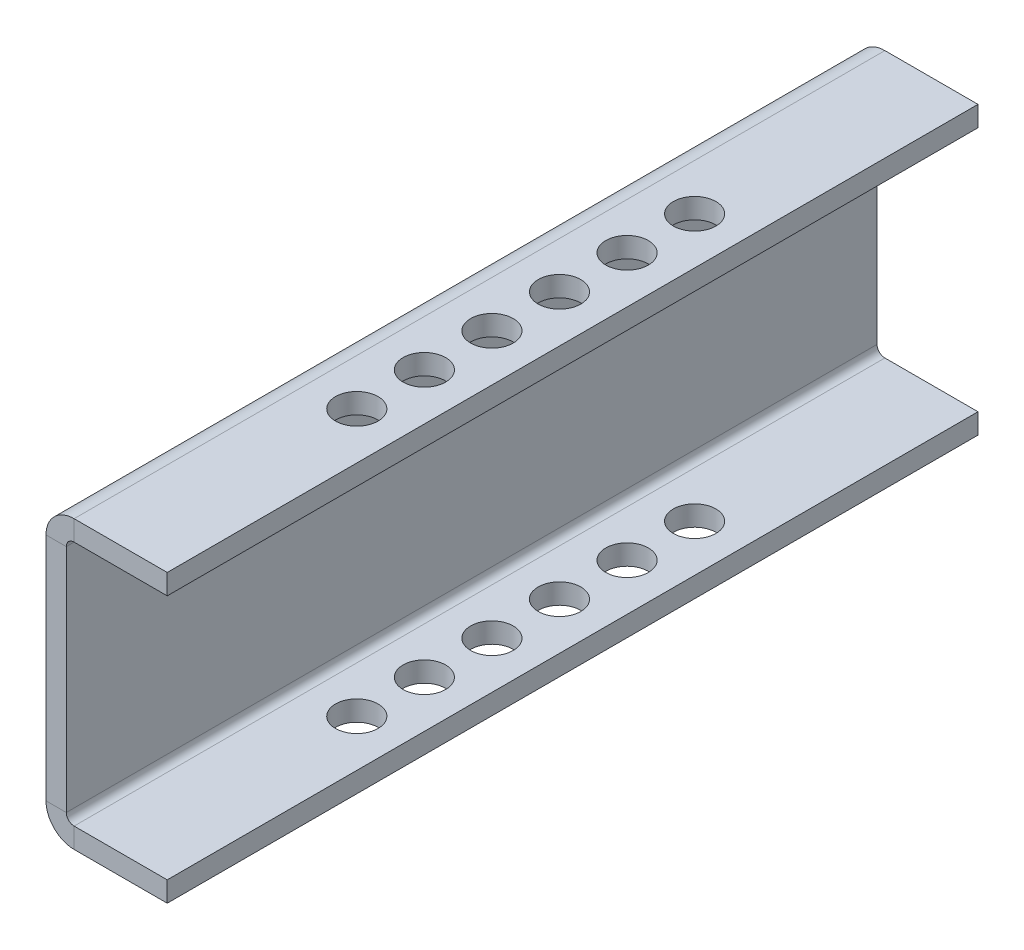
ISO-10303-21;
HEADER;
FILE_DESCRIPTION(('STEP AP214'),'2;1');
FILE_NAME('part.step','',(''),(''),'','','');
FILE_SCHEMA(('AUTOMOTIVE_DESIGN { 1 0 10303 214 1 1 1 1 }'));
ENDSEC;
DATA;
#1=APPLICATION_CONTEXT('core data for automotive mechanical design processes');
#2=APPLICATION_PROTOCOL_DEFINITION('international standard','automotive_design',2000,#1);
#3=PRODUCT_CONTEXT('',#1,'mechanical');
#4=PRODUCT('Part','Part','',(#3));
#5=PRODUCT_RELATED_PRODUCT_CATEGORY('part','',(#4));
#6=PRODUCT_DEFINITION_FORMATION('','',#4);
#7=PRODUCT_DEFINITION_CONTEXT('part definition',#1,'design');
#8=PRODUCT_DEFINITION('design','',#6,#7);
#9=PRODUCT_DEFINITION_SHAPE('','',#8);
#10=(LENGTH_UNIT() NAMED_UNIT(*) SI_UNIT(.MILLI.,.METRE.));
#11=(NAMED_UNIT(*) PLANE_ANGLE_UNIT() SI_UNIT($,.RADIAN.));
#12=(NAMED_UNIT(*) SI_UNIT($,.STERADIAN.) SOLID_ANGLE_UNIT());
#13=UNCERTAINTY_MEASURE_WITH_UNIT(LENGTH_MEASURE(1.E-05),#10,'distance_accuracy_value','');
#14=(GEOMETRIC_REPRESENTATION_CONTEXT(3) GLOBAL_UNCERTAINTY_ASSIGNED_CONTEXT((#13)) GLOBAL_UNIT_ASSIGNED_CONTEXT((#10,
#11,#12)) REPRESENTATION_CONTEXT('',''));
#15=CARTESIAN_POINT('',(0.,0.,0.));
#16=DIRECTION('',(0.,0.,1.));
#17=DIRECTION('',(1.,0.,0.));
#18=AXIS2_PLACEMENT_3D('',#15,#16,#17);
#19=CARTESIAN_POINT('',(-1.905,0.,0.));
#20=DIRECTION('',(-1.,0.,0.));
#21=DIRECTION('',(0.,0.,1.));
#22=AXIS2_PLACEMENT_3D('',#19,#20,#21);
#23=PLANE('',#22);
#24=DIRECTION('',(0.,-1.,0.));
#25=VECTOR('',#24,1.);
#26=CARTESIAN_POINT('',(-1.905,22.225,38.1));
#27=LINE('',#26,#25);
#28=CARTESIAN_POINT('',(-1.905,10.8204,38.1));
#29=VERTEX_POINT('',#28);
#30=CARTESIAN_POINT('',(-1.905,-10.8204,38.1));
#31=VERTEX_POINT('',#30);
#32=EDGE_CURVE('E248',#29,#31,#27,.T.);
#33=ORIENTED_EDGE('',*,*,#32,.F.);
#34=DIRECTION('',(0.,0.,-1.));
#35=VECTOR('',#34,1.);
#36=CARTESIAN_POINT('',(-1.905,10.8204,0.));
#37=LINE('',#36,#35);
#38=CARTESIAN_POINT('',(-1.905,10.8204,-38.1));
#39=VERTEX_POINT('',#38);
#40=EDGE_CURVE('E239',#29,#39,#37,.T.);
#41=ORIENTED_EDGE('',*,*,#40,.T.);
#42=DIRECTION('',(0.,1.,0.));
#43=VECTOR('',#42,1.);
#44=CARTESIAN_POINT('',(-1.905,22.225,-38.1));
#45=LINE('',#44,#43);
#46=CARTESIAN_POINT('',(-1.905,-10.8204,-38.1));
#47=VERTEX_POINT('',#46);
#48=EDGE_CURVE('E231',#47,#39,#45,.T.);
#49=ORIENTED_EDGE('',*,*,#48,.F.);
#50=DIRECTION('',(0.,0.,-1.));
#51=VECTOR('',#50,1.);
#52=CARTESIAN_POINT('',(-1.905,-10.8204,0.));
#53=LINE('',#52,#51);
#54=EDGE_CURVE('E227',#31,#47,#53,.T.);
#55=ORIENTED_EDGE('',*,*,#54,.F.);
#56=EDGE_LOOP('',(#33,#41,#49,#55));
#57=FACE_BOUND('',#56,.T.);
#58=ADVANCED_FACE('F47',(#57),#23,.T.);
#59=CARTESIAN_POINT('',(-1.905,22.225,-38.1));
#60=DIRECTION('',(0.,0.,-1.));
#61=DIRECTION('',(-1.,0.,0.));
#62=AXIS2_PLACEMENT_3D('',#59,#60,#61);
#63=PLANE('',#62);
#64=ORIENTED_EDGE('',*,*,#48,.T.);
#65=DIRECTION('',(1.,0.,0.));
#66=VECTOR('',#65,1.);
#67=CARTESIAN_POINT('',(-1.905,10.8204,-38.1));
#68=LINE('',#67,#66);
#69=CARTESIAN_POINT('',(0.,10.8204,-38.1));
#70=VERTEX_POINT('',#69);
#71=EDGE_CURVE('E12',#39,#70,#68,.T.);
#72=ORIENTED_EDGE('',*,*,#71,.T.);
#73=DIRECTION('',(0.,1.,0.));
#74=VECTOR('',#73,1.);
#75=CARTESIAN_POINT('',(0.,22.225,-38.1));
#76=LINE('',#75,#74);
#77=CARTESIAN_POINT('',(0.,-10.8204,-38.1));
#78=VERTEX_POINT('',#77);
#79=EDGE_CURVE('E249',#78,#70,#76,.T.);
#80=ORIENTED_EDGE('',*,*,#79,.F.);
#81=DIRECTION('',(1.,0.,0.));
#82=VECTOR('',#81,1.);
#83=CARTESIAN_POINT('',(-1.905,-10.8204,-38.1));
#84=LINE('',#83,#82);
#85=EDGE_CURVE('E230',#47,#78,#84,.T.);
#86=ORIENTED_EDGE('',*,*,#85,.F.);
#87=EDGE_LOOP('',(#64,#72,#80,#86));
#88=FACE_BOUND('',#87,.T.);
#89=ADVANCED_FACE('F49',(#88),#63,.T.);
#90=CARTESIAN_POINT('',(-1.905,22.225,38.1));
#91=DIRECTION('',(0.,0.,1.));
#92=DIRECTION('',(0.,-1.,0.));
#93=AXIS2_PLACEMENT_3D('',#90,#91,#92);
#94=PLANE('',#93);
#95=DIRECTION('',(0.,-1.,0.));
#96=VECTOR('',#95,1.);
#97=CARTESIAN_POINT('',(0.,22.225,38.1));
#98=LINE('',#97,#96);
#99=CARTESIAN_POINT('',(0.,10.8204,38.1));
#100=VERTEX_POINT('',#99);
#101=CARTESIAN_POINT('',(0.,-10.8204,38.1));
#102=VERTEX_POINT('',#101);
#103=EDGE_CURVE('E70',#100,#102,#98,.T.);
#104=ORIENTED_EDGE('',*,*,#103,.F.);
#105=DIRECTION('',(-1.,0.,0.));
#106=VECTOR('',#105,1.);
#107=CARTESIAN_POINT('',(-1.905,10.8204,38.1));
#108=LINE('',#107,#106);
#109=EDGE_CURVE('E242',#100,#29,#108,.T.);
#110=ORIENTED_EDGE('',*,*,#109,.T.);
#111=ORIENTED_EDGE('',*,*,#32,.T.);
#112=DIRECTION('',(-1.,0.,0.));
#113=VECTOR('',#112,1.);
#114=CARTESIAN_POINT('',(-1.905,-10.8204,38.1));
#115=LINE('',#114,#113);
#116=EDGE_CURVE('E236',#102,#31,#115,.T.);
#117=ORIENTED_EDGE('',*,*,#116,.F.);
#118=EDGE_LOOP('',(#104,#110,#111,#117));
#119=FACE_BOUND('',#118,.T.);
#120=ADVANCED_FACE('F308',(#119),#94,.T.);
#121=CARTESIAN_POINT('',(0.,0.,0.));
#122=DIRECTION('',(-1.,0.,0.));
#123=DIRECTION('',(0.,0.,1.));
#124=AXIS2_PLACEMENT_3D('',#121,#122,#123);
#125=PLANE('',#124);
#126=DIRECTION('',(0.,0.,-1.));
#127=VECTOR('',#126,1.);
#128=CARTESIAN_POINT('',(0.,10.8204,0.));
#129=LINE('',#128,#127);
#130=EDGE_CURVE('E56',#100,#70,#129,.T.);
#131=ORIENTED_EDGE('',*,*,#130,.F.);
#132=ORIENTED_EDGE('',*,*,#103,.T.);
#133=DIRECTION('',(0.,0.,-1.));
#134=VECTOR('',#133,1.);
#135=CARTESIAN_POINT('',(0.,-10.8204,0.));
#136=LINE('',#135,#134);
#137=EDGE_CURVE('E234',#102,#78,#136,.T.);
#138=ORIENTED_EDGE('',*,*,#137,.T.);
#139=ORIENTED_EDGE('',*,*,#79,.T.);
#140=EDGE_LOOP('',(#131,#132,#138,#139));
#141=FACE_BOUND('',#140,.T.);
#142=ADVANCED_FACE('F368',(#141),#125,.F.);
#143=CARTESIAN_POINT('',(0.7366,-10.8204,38.1));
#144=DIRECTION('',(0.,0.,1.));
#145=DIRECTION('',(1.,0.,0.));
#146=AXIS2_PLACEMENT_3D('',#143,#144,#145);
#147=PLANE('',#146);
#148=DIRECTION('',(0.,-1.,0.));
#149=VECTOR('',#148,1.);
#150=CARTESIAN_POINT('',(0.736600000000009,-13.462,38.1));
#151=LINE('',#150,#149);
#152=CARTESIAN_POINT('',(0.736600000000002,-11.557,38.1));
#153=VERTEX_POINT('',#152);
#154=CARTESIAN_POINT('',(0.736600000000016,-13.462,38.1));
#155=VERTEX_POINT('',#154);
#156=EDGE_CURVE('E192',#153,#155,#151,.T.);
#157=ORIENTED_EDGE('',*,*,#156,.F.);
#158=CARTESIAN_POINT('',(0.7366,-10.8204,38.1));
#159=DIRECTION('',(0.,0.,1.));
#160=DIRECTION('',(0.,-1.,0.));
#161=AXIS2_PLACEMENT_3D('',#158,#159,#160);
#162=CIRCLE('',#161,0.7366);
#163=EDGE_CURVE('E189',#153,#102,#162,.F.);
#164=ORIENTED_EDGE('',*,*,#163,.T.);
#165=ORIENTED_EDGE('',*,*,#116,.T.);
#166=CARTESIAN_POINT('',(0.7366,-10.8204,38.1));
#167=DIRECTION('',(0.,0.,-1.));
#168=DIRECTION('',(1.,0.,0.));
#169=AXIS2_PLACEMENT_3D('',#166,#167,#168);
#170=CIRCLE('',#169,2.6416);
#171=EDGE_CURVE('E216',#155,#31,#170,.T.);
#172=ORIENTED_EDGE('',*,*,#171,.F.);
#173=EDGE_LOOP('',(#157,#164,#165,#172));
#174=FACE_BOUND('',#173,.T.);
#175=ADVANCED_FACE('F338',(#174),#147,.T.);
#176=CARTESIAN_POINT('',(0.7366,-10.8204,-38.1));
#177=DIRECTION('',(0.,0.,-1.));
#178=DIRECTION('',(-1.,0.,0.));
#179=AXIS2_PLACEMENT_3D('',#176,#177,#178);
#180=PLANE('',#179);
#181=CARTESIAN_POINT('',(0.7366,-10.8204,-38.1));
#182=DIRECTION('',(0.,0.,1.));
#183=DIRECTION('',(0.,-1.,0.));
#184=AXIS2_PLACEMENT_3D('',#181,#182,#183);
#185=CIRCLE('',#184,0.7366);
#186=CARTESIAN_POINT('',(0.7366,-11.557,-38.1));
#187=VERTEX_POINT('',#186);
#188=EDGE_CURVE('E220',#78,#187,#185,.T.);
#189=ORIENTED_EDGE('',*,*,#188,.T.);
#190=DIRECTION('',(0.,1.,0.));
#191=VECTOR('',#190,1.);
#192=CARTESIAN_POINT('',(0.736600000000007,-13.462,-38.1));
#193=LINE('',#192,#191);
#194=CARTESIAN_POINT('',(0.736600000000007,-13.462,-38.1));
#195=VERTEX_POINT('',#194);
#196=EDGE_CURVE('E201',#195,#187,#193,.T.);
#197=ORIENTED_EDGE('',*,*,#196,.F.);
#198=CARTESIAN_POINT('',(0.7366,-10.8204,-38.1));
#199=DIRECTION('',(0.,0.,1.));
#200=DIRECTION('',(-1.,0.,0.));
#201=AXIS2_PLACEMENT_3D('',#198,#199,#200);
#202=CIRCLE('',#201,2.6416);
#203=EDGE_CURVE('E219',#47,#195,#202,.T.);
#204=ORIENTED_EDGE('',*,*,#203,.F.);
#205=ORIENTED_EDGE('',*,*,#85,.T.);
#206=EDGE_LOOP('',(#189,#197,#204,#205));
#207=FACE_BOUND('',#206,.T.);
#208=ADVANCED_FACE('F324',(#207),#180,.T.);
#209=CARTESIAN_POINT('',(0.7366,-10.8204,-76.2699722397153));
#210=DIRECTION('',(0.,0.,1.));
#211=DIRECTION('',(0.,-1.,0.));
#212=AXIS2_PLACEMENT_3D('',#209,#210,#211);
#213=CYLINDRICAL_SURFACE('',#212,2.6416);
#214=ORIENTED_EDGE('',*,*,#54,.T.);
#215=ORIENTED_EDGE('',*,*,#203,.T.);
#216=DIRECTION('',(0.,0.,-1.));
#217=VECTOR('',#216,1.);
#218=CARTESIAN_POINT('',(0.736600000000009,-13.462,0.));
#219=LINE('',#218,#217);
#220=EDGE_CURVE('E207',#155,#195,#219,.T.);
#221=ORIENTED_EDGE('',*,*,#220,.F.);
#222=ORIENTED_EDGE('',*,*,#171,.T.);
#223=EDGE_LOOP('',(#214,#215,#221,#222));
#224=FACE_BOUND('',#223,.T.);
#225=ADVANCED_FACE('F320',(#224),#213,.T.);
#226=CARTESIAN_POINT('',(0.7366,-10.8204,-76.2699722397153));
#227=DIRECTION('',(0.,0.,1.));
#228=DIRECTION('',(0.,-1.,0.));
#229=AXIS2_PLACEMENT_3D('',#226,#227,#228);
#230=CYLINDRICAL_SURFACE('',#229,0.7366);
#231=ORIENTED_EDGE('',*,*,#137,.F.);
#232=ORIENTED_EDGE('',*,*,#163,.F.);
#233=DIRECTION('',(0.,0.,-1.));
#234=VECTOR('',#233,1.);
#235=CARTESIAN_POINT('',(0.736600000000002,-11.557,0.));
#236=LINE('',#235,#234);
#237=EDGE_CURVE('E182',#153,#187,#236,.T.);
#238=ORIENTED_EDGE('',*,*,#237,.T.);
#239=ORIENTED_EDGE('',*,*,#188,.F.);
#240=EDGE_LOOP('',(#231,#232,#238,#239));
#241=FACE_BOUND('',#240,.T.);
#242=ADVANCED_FACE('F333',(#241),#230,.F.);
#243=CARTESIAN_POINT('',(9.48796792441074,-13.462,-38.1));
#244=DIRECTION('',(1.,0.,0.));
#245=DIRECTION('',(0.,0.,-1.));
#246=AXIS2_PLACEMENT_3D('',#243,#244,#245);
#247=PLANE('',#246);
#248=DIRECTION('',(0.,0.,-1.));
#249=VECTOR('',#248,1.);
#250=CARTESIAN_POINT('',(9.48796792441073,-11.557,-38.1));
#251=LINE('',#250,#249);
#252=CARTESIAN_POINT('',(9.48796792441074,-11.557,38.1));
#253=VERTEX_POINT('',#252);
#254=CARTESIAN_POINT('',(9.48796792441073,-11.557,-38.1));
#255=VERTEX_POINT('',#254);
#256=EDGE_CURVE('E196',#253,#255,#251,.T.);
#257=ORIENTED_EDGE('',*,*,#256,.F.);
#258=DIRECTION('',(0.,1.,0.));
#259=VECTOR('',#258,1.);
#260=CARTESIAN_POINT('',(9.48796792441075,-13.462,38.1));
#261=LINE('',#260,#259);
#262=CARTESIAN_POINT('',(9.48796792441075,-13.462,38.1));
#263=VERTEX_POINT('',#262);
#264=EDGE_CURVE('E186',#263,#253,#261,.T.);
#265=ORIENTED_EDGE('',*,*,#264,.F.);
#266=DIRECTION('',(0.,0.,-1.));
#267=VECTOR('',#266,1.);
#268=CARTESIAN_POINT('',(9.48796792441074,-13.462,-38.1));
#269=LINE('',#268,#267);
#270=CARTESIAN_POINT('',(9.48796792441074,-13.462,-38.1));
#271=VERTEX_POINT('',#270);
#272=EDGE_CURVE('E211',#263,#271,#269,.T.);
#273=ORIENTED_EDGE('',*,*,#272,.T.);
#274=DIRECTION('',(0.,1.,0.));
#275=VECTOR('',#274,1.);
#276=CARTESIAN_POINT('',(9.48796792441074,-13.462,-38.1));
#277=LINE('',#276,#275);
#278=EDGE_CURVE('E209',#271,#255,#277,.T.);
#279=ORIENTED_EDGE('',*,*,#278,.T.);
#280=EDGE_LOOP('',(#257,#265,#273,#279));
#281=FACE_BOUND('',#280,.T.);
#282=ADVANCED_FACE('F348',(#281),#247,.T.);
#283=CARTESIAN_POINT('',(-12.7370320755893,-13.462,0.));
#284=DIRECTION('',(0.,-1.,0.));
#285=DIRECTION('',(0.,0.,1.));
#286=AXIS2_PLACEMENT_3D('',#283,#284,#285);
#287=PLANE('',#286);
#288=CARTESIAN_POINT('',(5.0799999999999,-13.462,15.875));
#289=DIRECTION('',(0.,-1.,0.));
#290=DIRECTION('',(1.,0.,0.));
#291=AXIS2_PLACEMENT_3D('',#288,#289,#290);
#292=CIRCLE('',#291,2.);
#293=CARTESIAN_POINT('',(7.0799999999999,-13.462,15.875));
#294=VERTEX_POINT('',#293);
#295=EDGE_CURVE('E713',#294,#294,#292,.F.);
#296=ORIENTED_EDGE('',*,*,#295,.T.);
#297=EDGE_LOOP('',(#296));
#298=FACE_BOUND('',#297,.T.);
#299=CARTESIAN_POINT('',(5.0799999999999,-13.462,-3.175));
#300=DIRECTION('',(0.,-1.,0.));
#301=DIRECTION('',(1.,0.,0.));
#302=AXIS2_PLACEMENT_3D('',#299,#300,#301);
#303=CIRCLE('',#302,2.);
#304=CARTESIAN_POINT('',(7.0799999999999,-13.462,-3.175));
#305=VERTEX_POINT('',#304);
#306=EDGE_CURVE('E734',#305,#305,#303,.F.);
#307=ORIENTED_EDGE('',*,*,#306,.T.);
#308=EDGE_LOOP('',(#307));
#309=FACE_BOUND('',#308,.T.);
#310=CARTESIAN_POINT('',(5.0799999999999,-13.462,-15.875));
#311=DIRECTION('',(0.,-1.,0.));
#312=DIRECTION('',(1.,0.,0.));
#313=AXIS2_PLACEMENT_3D('',#310,#311,#312);
#314=CIRCLE('',#313,2.);
#315=CARTESIAN_POINT('',(7.0799999999999,-13.462,-15.875));
#316=VERTEX_POINT('',#315);
#317=EDGE_CURVE('E740',#316,#316,#314,.F.);
#318=ORIENTED_EDGE('',*,*,#317,.T.);
#319=EDGE_LOOP('',(#318));
#320=FACE_BOUND('',#319,.T.);
#321=CARTESIAN_POINT('',(5.0799999999999,-13.462,-9.525));
#322=DIRECTION('',(0.,-1.,0.));
#323=DIRECTION('',(1.,0.,0.));
#324=AXIS2_PLACEMENT_3D('',#321,#322,#323);
#325=CIRCLE('',#324,2.);
#326=CARTESIAN_POINT('',(7.0799999999999,-13.462,-9.525));
#327=VERTEX_POINT('',#326);
#328=EDGE_CURVE('E747',#327,#327,#325,.F.);
#329=ORIENTED_EDGE('',*,*,#328,.T.);
#330=EDGE_LOOP('',(#329));
#331=FACE_BOUND('',#330,.T.);
#332=CARTESIAN_POINT('',(5.0799999999999,-13.462,9.525));
#333=DIRECTION('',(0.,-1.,0.));
#334=DIRECTION('',(1.,0.,0.));
#335=AXIS2_PLACEMENT_3D('',#332,#333,#334);
#336=CIRCLE('',#335,2.);
#337=CARTESIAN_POINT('',(7.0799999999999,-13.462,9.525));
#338=VERTEX_POINT('',#337);
#339=EDGE_CURVE('E752',#338,#338,#336,.F.);
#340=ORIENTED_EDGE('',*,*,#339,.T.);
#341=EDGE_LOOP('',(#340));
#342=FACE_BOUND('',#341,.T.);
#343=CARTESIAN_POINT('',(5.0799999999999,-13.462,3.175));
#344=DIRECTION('',(0.,-1.,0.));
#345=DIRECTION('',(1.,0.,0.));
#346=AXIS2_PLACEMENT_3D('',#343,#344,#345);
#347=CIRCLE('',#346,2.);
#348=CARTESIAN_POINT('',(7.0799999999999,-13.462,3.175));
#349=VERTEX_POINT('',#348);
#350=EDGE_CURVE('E259',#349,#349,#347,.F.);
#351=ORIENTED_EDGE('',*,*,#350,.T.);
#352=EDGE_LOOP('',(#351));
#353=FACE_BOUND('',#352,.T.);
#354=DIRECTION('',(1.,0.,0.));
#355=VECTOR('',#354,1.);
#356=CARTESIAN_POINT('',(-34.9620320755892,-13.4620000000001,38.1));
#357=LINE('',#356,#355);
#358=EDGE_CURVE('E190',#155,#263,#357,.T.);
#359=ORIENTED_EDGE('',*,*,#358,.F.);
#360=ORIENTED_EDGE('',*,*,#220,.T.);
#361=DIRECTION('',(-1.,0.,0.));
#362=VECTOR('',#361,1.);
#363=CARTESIAN_POINT('',(-34.9620320755893,-13.4620000000001,-38.1));
#364=LINE('',#363,#362);
#365=EDGE_CURVE('E204',#271,#195,#364,.T.);
#366=ORIENTED_EDGE('',*,*,#365,.F.);
#367=ORIENTED_EDGE('',*,*,#272,.F.);
#368=EDGE_LOOP('',(#359,#360,#366,#367));
#369=FACE_BOUND('',#368,.T.);
#370=ADVANCED_FACE('F345',(#298,#309,#320,#331,#342,#353,#369),#287,.T.);
#371=CARTESIAN_POINT('',(-34.9620320755893,-13.4620000000001,-38.1));
#372=DIRECTION('',(0.,0.,-1.));
#373=DIRECTION('',(0.,-1.,0.));
#374=AXIS2_PLACEMENT_3D('',#371,#372,#373);
#375=PLANE('',#374);
#376=ORIENTED_EDGE('',*,*,#365,.T.);
#377=ORIENTED_EDGE('',*,*,#196,.T.);
#378=DIRECTION('',(-1.,0.,0.));
#379=VECTOR('',#378,1.);
#380=CARTESIAN_POINT('',(-34.9620320755893,-11.5570000000001,-38.1));
#381=LINE('',#380,#379);
#382=EDGE_CURVE('E194',#255,#187,#381,.T.);
#383=ORIENTED_EDGE('',*,*,#382,.F.);
#384=ORIENTED_EDGE('',*,*,#278,.F.);
#385=EDGE_LOOP('',(#376,#377,#383,#384));
#386=FACE_BOUND('',#385,.T.);
#387=ADVANCED_FACE('F327',(#386),#375,.T.);
#388=CARTESIAN_POINT('',(-12.7370320755893,-11.557,0.));
#389=DIRECTION('',(0.,-1.,0.));
#390=DIRECTION('',(0.,0.,1.));
#391=AXIS2_PLACEMENT_3D('',#388,#389,#390);
#392=PLANE('',#391);
#393=CARTESIAN_POINT('',(5.07999999999991,-11.557,15.875));
#394=DIRECTION('',(0.,-1.,0.));
#395=DIRECTION('',(1.,0.,0.));
#396=AXIS2_PLACEMENT_3D('',#393,#394,#395);
#397=CIRCLE('',#396,2.);
#398=CARTESIAN_POINT('',(7.07999999999991,-11.557,15.875));
#399=VERTEX_POINT('',#398);
#400=EDGE_CURVE('E174',#399,#399,#397,.T.);
#401=ORIENTED_EDGE('',*,*,#400,.T.);
#402=EDGE_LOOP('',(#401));
#403=FACE_BOUND('',#402,.T.);
#404=CARTESIAN_POINT('',(5.07999999999991,-11.557,-3.175));
#405=DIRECTION('',(0.,-1.,0.));
#406=DIRECTION('',(1.,0.,0.));
#407=AXIS2_PLACEMENT_3D('',#404,#405,#406);
#408=CIRCLE('',#407,2.);
#409=CARTESIAN_POINT('',(7.07999999999991,-11.557,-3.175));
#410=VERTEX_POINT('',#409);
#411=EDGE_CURVE('E273',#410,#410,#408,.T.);
#412=ORIENTED_EDGE('',*,*,#411,.T.);
#413=EDGE_LOOP('',(#412));
#414=FACE_BOUND('',#413,.T.);
#415=CARTESIAN_POINT('',(5.07999999999991,-11.557,-15.875));
#416=DIRECTION('',(0.,-1.,0.));
#417=DIRECTION('',(1.,0.,0.));
#418=AXIS2_PLACEMENT_3D('',#415,#416,#417);
#419=CIRCLE('',#418,2.);
#420=CARTESIAN_POINT('',(7.07999999999991,-11.557,-15.875));
#421=VERTEX_POINT('',#420);
#422=EDGE_CURVE('E270',#421,#421,#419,.T.);
#423=ORIENTED_EDGE('',*,*,#422,.T.);
#424=EDGE_LOOP('',(#423));
#425=FACE_BOUND('',#424,.T.);
#426=CARTESIAN_POINT('',(5.07999999999991,-11.557,-9.525));
#427=DIRECTION('',(0.,-1.,0.));
#428=DIRECTION('',(1.,0.,0.));
#429=AXIS2_PLACEMENT_3D('',#426,#427,#428);
#430=CIRCLE('',#429,2.);
#431=CARTESIAN_POINT('',(7.07999999999991,-11.557,-9.525));
#432=VERTEX_POINT('',#431);
#433=EDGE_CURVE('E267',#432,#432,#430,.T.);
#434=ORIENTED_EDGE('',*,*,#433,.T.);
#435=EDGE_LOOP('',(#434));
#436=FACE_BOUND('',#435,.T.);
#437=CARTESIAN_POINT('',(5.07999999999991,-11.557,9.525));
#438=DIRECTION('',(0.,-1.,0.));
#439=DIRECTION('',(1.,0.,0.));
#440=AXIS2_PLACEMENT_3D('',#437,#438,#439);
#441=CIRCLE('',#440,2.);
#442=CARTESIAN_POINT('',(7.07999999999991,-11.557,9.525));
#443=VERTEX_POINT('',#442);
#444=EDGE_CURVE('E263',#443,#443,#441,.T.);
#445=ORIENTED_EDGE('',*,*,#444,.T.);
#446=EDGE_LOOP('',(#445));
#447=FACE_BOUND('',#446,.T.);
#448=CARTESIAN_POINT('',(5.07999999999991,-11.557,3.175));
#449=DIRECTION('',(0.,-1.,0.));
#450=DIRECTION('',(1.,0.,0.));
#451=AXIS2_PLACEMENT_3D('',#448,#449,#450);
#452=CIRCLE('',#451,2.);
#453=CARTESIAN_POINT('',(7.07999999999991,-11.557,3.175));
#454=VERTEX_POINT('',#453);
#455=EDGE_CURVE('E258',#454,#454,#452,.T.);
#456=ORIENTED_EDGE('',*,*,#455,.T.);
#457=EDGE_LOOP('',(#456));
#458=FACE_BOUND('',#457,.T.);
#459=ORIENTED_EDGE('',*,*,#237,.F.);
#460=DIRECTION('',(1.,0.,0.));
#461=VECTOR('',#460,1.);
#462=CARTESIAN_POINT('',(-34.9620320755893,-11.5570000000001,38.1));
#463=LINE('',#462,#461);
#464=EDGE_CURVE('E199',#153,#253,#463,.T.);
#465=ORIENTED_EDGE('',*,*,#464,.T.);
#466=ORIENTED_EDGE('',*,*,#256,.T.);
#467=ORIENTED_EDGE('',*,*,#382,.T.);
#468=EDGE_LOOP('',(#459,#465,#466,#467));
#469=FACE_BOUND('',#468,.T.);
#470=ADVANCED_FACE('F336',(#403,#414,#425,#436,#447,#458,#469),#392,.F.);
#471=CARTESIAN_POINT('',(-34.9620320755892,-13.4620000000001,38.1));
#472=DIRECTION('',(0.,0.,1.));
#473=DIRECTION('',(1.,0.,0.));
#474=AXIS2_PLACEMENT_3D('',#471,#472,#473);
#475=PLANE('',#474);
#476=ORIENTED_EDGE('',*,*,#464,.F.);
#477=ORIENTED_EDGE('',*,*,#156,.T.);
#478=ORIENTED_EDGE('',*,*,#358,.T.);
#479=ORIENTED_EDGE('',*,*,#264,.T.);
#480=EDGE_LOOP('',(#476,#477,#478,#479));
#481=FACE_BOUND('',#480,.T.);
#482=ADVANCED_FACE('F341',(#481),#475,.T.);
#483=CARTESIAN_POINT('',(0.7366,10.8204,38.1));
#484=DIRECTION('',(0.,0.,1.));
#485=DIRECTION('',(1.,0.,0.));
#486=AXIS2_PLACEMENT_3D('',#483,#484,#485);
#487=PLANE('',#486);
#488=ORIENTED_EDGE('',*,*,#109,.F.);
#489=CARTESIAN_POINT('',(0.7366,10.8204,38.1));
#490=DIRECTION('',(0.,0.,-1.));
#491=DIRECTION('',(0.,1.,0.));
#492=AXIS2_PLACEMENT_3D('',#489,#490,#491);
#493=CIRCLE('',#492,0.7366);
#494=CARTESIAN_POINT('',(0.736600000000002,11.557,38.1));
#495=VERTEX_POINT('',#494);
#496=EDGE_CURVE('E157',#100,#495,#493,.T.);
#497=ORIENTED_EDGE('',*,*,#496,.T.);
#498=DIRECTION('',(0.,1.,0.));
#499=VECTOR('',#498,1.);
#500=CARTESIAN_POINT('',(0.736600000000009,13.462,38.1));
#501=LINE('',#500,#499);
#502=CARTESIAN_POINT('',(0.736600000000007,13.462,38.1));
#503=VERTEX_POINT('',#502);
#504=EDGE_CURVE('E164',#495,#503,#501,.T.);
#505=ORIENTED_EDGE('',*,*,#504,.T.);
#506=CARTESIAN_POINT('',(0.7366,10.8204,38.1));
#507=DIRECTION('',(0.,0.,-1.));
#508=DIRECTION('',(1.,0.,0.));
#509=AXIS2_PLACEMENT_3D('',#506,#507,#508);
#510=CIRCLE('',#509,2.6416);
#511=EDGE_CURVE('E175',#29,#503,#510,.T.);
#512=ORIENTED_EDGE('',*,*,#511,.F.);
#513=EDGE_LOOP('',(#488,#497,#505,#512));
#514=FACE_BOUND('',#513,.T.);
#515=ADVANCED_FACE('F300',(#514),#487,.T.);
#516=CARTESIAN_POINT('',(0.7366,10.8204,-38.1));
#517=DIRECTION('',(0.,0.,-1.));
#518=DIRECTION('',(-1.,0.,0.));
#519=AXIS2_PLACEMENT_3D('',#516,#517,#518);
#520=PLANE('',#519);
#521=DIRECTION('',(0.,-1.,0.));
#522=VECTOR('',#521,1.);
#523=CARTESIAN_POINT('',(0.736600000000009,13.462,-38.1));
#524=LINE('',#523,#522);
#525=CARTESIAN_POINT('',(0.736600000000011,13.462,-38.1));
#526=VERTEX_POINT('',#525);
#527=CARTESIAN_POINT('',(0.736600000000002,11.557,-38.1));
#528=VERTEX_POINT('',#527);
#529=EDGE_CURVE('E146',#526,#528,#524,.T.);
#530=ORIENTED_EDGE('',*,*,#529,.T.);
#531=CARTESIAN_POINT('',(0.7366,10.8204,-38.1));
#532=DIRECTION('',(0.,0.,-1.));
#533=DIRECTION('',(0.,1.,0.));
#534=AXIS2_PLACEMENT_3D('',#531,#532,#533);
#535=CIRCLE('',#534,0.7366);
#536=EDGE_CURVE('E179',#528,#70,#535,.F.);
#537=ORIENTED_EDGE('',*,*,#536,.T.);
#538=ORIENTED_EDGE('',*,*,#71,.F.);
#539=CARTESIAN_POINT('',(0.7366,10.8204,-38.1));
#540=DIRECTION('',(0.,0.,1.));
#541=DIRECTION('',(-1.,0.,0.));
#542=AXIS2_PLACEMENT_3D('',#539,#540,#541);
#543=CIRCLE('',#542,2.6416);
#544=EDGE_CURVE('E178',#526,#39,#543,.T.);
#545=ORIENTED_EDGE('',*,*,#544,.F.);
#546=EDGE_LOOP('',(#530,#537,#538,#545));
#547=FACE_BOUND('',#546,.T.);
#548=ADVANCED_FACE('F313',(#547),#520,.T.);
#549=CARTESIAN_POINT('',(0.7366,10.8204,76.2699722397153));
#550=DIRECTION('',(0.,0.,-1.));
#551=DIRECTION('',(0.,1.,0.));
#552=AXIS2_PLACEMENT_3D('',#549,#550,#551);
#553=CYLINDRICAL_SURFACE('',#552,2.6416);
#554=ORIENTED_EDGE('',*,*,#544,.T.);
#555=ORIENTED_EDGE('',*,*,#40,.F.);
#556=ORIENTED_EDGE('',*,*,#511,.T.);
#557=DIRECTION('',(0.,0.,-1.));
#558=VECTOR('',#557,1.);
#559=CARTESIAN_POINT('',(0.736600000000009,13.462,0.));
#560=LINE('',#559,#558);
#561=EDGE_CURVE('E172',#503,#526,#560,.T.);
#562=ORIENTED_EDGE('',*,*,#561,.T.);
#563=EDGE_LOOP('',(#554,#555,#556,#562));
#564=FACE_BOUND('',#563,.T.);
#565=ADVANCED_FACE('F303',(#564),#553,.T.);
#566=CARTESIAN_POINT('',(0.7366,10.8204,76.2699722397153));
#567=DIRECTION('',(0.,0.,-1.));
#568=DIRECTION('',(0.,1.,0.));
#569=AXIS2_PLACEMENT_3D('',#566,#567,#568);
#570=CYLINDRICAL_SURFACE('',#569,0.7366);
#571=ORIENTED_EDGE('',*,*,#536,.F.);
#572=DIRECTION('',(0.,0.,-1.));
#573=VECTOR('',#572,1.);
#574=CARTESIAN_POINT('',(0.736600000000002,11.557,0.));
#575=LINE('',#574,#573);
#576=EDGE_CURVE('E290',#495,#528,#575,.T.);
#577=ORIENTED_EDGE('',*,*,#576,.F.);
#578=ORIENTED_EDGE('',*,*,#496,.F.);
#579=ORIENTED_EDGE('',*,*,#130,.T.);
#580=EDGE_LOOP('',(#571,#577,#578,#579));
#581=FACE_BOUND('',#580,.T.);
#582=ADVANCED_FACE('F309',(#581),#570,.F.);
#583=CARTESIAN_POINT('',(9.48796792441074,13.462,-38.1));
#584=DIRECTION('',(1.,0.,0.));
#585=DIRECTION('',(0.,0.,1.));
#586=AXIS2_PLACEMENT_3D('',#583,#584,#585);
#587=PLANE('',#586);
#588=DIRECTION('',(0.,0.,1.));
#589=VECTOR('',#588,1.);
#590=CARTESIAN_POINT('',(9.48796792441073,11.557,-38.1));
#591=LINE('',#590,#589);
#592=CARTESIAN_POINT('',(9.48796792441073,11.557,-38.1));
#593=VERTEX_POINT('',#592);
#594=CARTESIAN_POINT('',(9.48796792441073,11.557,38.1));
#595=VERTEX_POINT('',#594);
#596=EDGE_CURVE('E150',#593,#595,#591,.T.);
#597=ORIENTED_EDGE('',*,*,#596,.F.);
#598=DIRECTION('',(0.,-1.,0.));
#599=VECTOR('',#598,1.);
#600=CARTESIAN_POINT('',(9.48796792441074,13.462,-38.1));
#601=LINE('',#600,#599);
#602=CARTESIAN_POINT('',(9.48796792441074,13.462,-38.1));
#603=VERTEX_POINT('',#602);
#604=EDGE_CURVE('E143',#603,#593,#601,.T.);
#605=ORIENTED_EDGE('',*,*,#604,.F.);
#606=DIRECTION('',(0.,0.,1.));
#607=VECTOR('',#606,1.);
#608=CARTESIAN_POINT('',(9.48796792441074,13.462,-38.1));
#609=LINE('',#608,#607);
#610=CARTESIAN_POINT('',(9.48796792441073,13.462,38.1));
#611=VERTEX_POINT('',#610);
#612=EDGE_CURVE('E155',#603,#611,#609,.T.);
#613=ORIENTED_EDGE('',*,*,#612,.T.);
#614=DIRECTION('',(0.,-1.,0.));
#615=VECTOR('',#614,1.);
#616=CARTESIAN_POINT('',(9.48796792441073,13.462,38.1));
#617=LINE('',#616,#615);
#618=EDGE_CURVE('E163',#611,#595,#617,.T.);
#619=ORIENTED_EDGE('',*,*,#618,.T.);
#620=EDGE_LOOP('',(#597,#605,#613,#619));
#621=FACE_BOUND('',#620,.T.);
#622=ADVANCED_FACE('F154',(#621),#587,.T.);
#623=CARTESIAN_POINT('',(-12.7370320755893,13.462,0.));
#624=DIRECTION('',(0.,1.,0.));
#625=DIRECTION('',(0.,0.,1.));
#626=AXIS2_PLACEMENT_3D('',#623,#624,#625);
#627=PLANE('',#626);
#628=CARTESIAN_POINT('',(5.07999999999999,13.462,15.875));
#629=DIRECTION('',(0.,1.,0.));
#630=DIRECTION('',(-1.,0.,0.));
#631=AXIS2_PLACEMENT_3D('',#628,#629,#630);
#632=CIRCLE('',#631,2.);
#633=CARTESIAN_POINT('',(3.07999999999999,13.462,15.875));
#634=VERTEX_POINT('',#633);
#635=EDGE_CURVE('E737',#634,#634,#632,.T.);
#636=ORIENTED_EDGE('',*,*,#635,.F.);
#637=EDGE_LOOP('',(#636));
#638=FACE_BOUND('',#637,.T.);
#639=CARTESIAN_POINT('',(5.07999999999999,13.462,-3.175));
#640=DIRECTION('',(0.,1.,0.));
#641=DIRECTION('',(-1.,0.,0.));
#642=AXIS2_PLACEMENT_3D('',#639,#640,#641);
#643=CIRCLE('',#642,2.);
#644=CARTESIAN_POINT('',(3.07999999999999,13.462,-3.175));
#645=VERTEX_POINT('',#644);
#646=EDGE_CURVE('E743',#645,#645,#643,.T.);
#647=ORIENTED_EDGE('',*,*,#646,.F.);
#648=EDGE_LOOP('',(#647));
#649=FACE_BOUND('',#648,.T.);
#650=CARTESIAN_POINT('',(5.08,13.462,-15.875));
#651=DIRECTION('',(0.,1.,0.));
#652=DIRECTION('',(-1.,0.,0.));
#653=AXIS2_PLACEMENT_3D('',#650,#651,#652);
#654=CIRCLE('',#653,2.);
#655=CARTESIAN_POINT('',(3.08,13.462,-15.875));
#656=VERTEX_POINT('',#655);
#657=EDGE_CURVE('E744',#656,#656,#654,.T.);
#658=ORIENTED_EDGE('',*,*,#657,.F.);
#659=EDGE_LOOP('',(#658));
#660=FACE_BOUND('',#659,.T.);
#661=CARTESIAN_POINT('',(5.08,13.462,-9.525));
#662=DIRECTION('',(0.,1.,0.));
#663=DIRECTION('',(-1.,0.,0.));
#664=AXIS2_PLACEMENT_3D('',#661,#662,#663);
#665=CIRCLE('',#664,2.);
#666=CARTESIAN_POINT('',(3.08,13.462,-9.525));
#667=VERTEX_POINT('',#666);
#668=EDGE_CURVE('E755',#667,#667,#665,.T.);
#669=ORIENTED_EDGE('',*,*,#668,.F.);
#670=EDGE_LOOP('',(#669));
#671=FACE_BOUND('',#670,.T.);
#672=CARTESIAN_POINT('',(5.07999999999999,13.462,9.525));
#673=DIRECTION('',(0.,1.,0.));
#674=DIRECTION('',(-1.,0.,0.));
#675=AXIS2_PLACEMENT_3D('',#672,#673,#674);
#676=CIRCLE('',#675,2.);
#677=CARTESIAN_POINT('',(3.07999999999999,13.462,9.525));
#678=VERTEX_POINT('',#677);
#679=EDGE_CURVE('E736',#678,#678,#676,.T.);
#680=ORIENTED_EDGE('',*,*,#679,.F.);
#681=EDGE_LOOP('',(#680));
#682=FACE_BOUND('',#681,.T.);
#683=CARTESIAN_POINT('',(5.07999999999999,13.462,3.175));
#684=DIRECTION('',(0.,1.,0.));
#685=DIRECTION('',(-1.,0.,0.));
#686=AXIS2_PLACEMENT_3D('',#683,#684,#685);
#687=CIRCLE('',#686,2.);
#688=CARTESIAN_POINT('',(3.07999999999999,13.462,3.175));
#689=VERTEX_POINT('',#688);
#690=EDGE_CURVE('E731',#689,#689,#687,.T.);
#691=ORIENTED_EDGE('',*,*,#690,.F.);
#692=EDGE_LOOP('',(#691));
#693=FACE_BOUND('',#692,.T.);
#694=ORIENTED_EDGE('',*,*,#561,.F.);
#695=DIRECTION('',(-1.,0.,0.));
#696=VECTOR('',#695,1.);
#697=CARTESIAN_POINT('',(9.48796792441073,13.462,38.1));
#698=LINE('',#697,#696);
#699=EDGE_CURVE('E162',#611,#503,#698,.T.);
#700=ORIENTED_EDGE('',*,*,#699,.F.);
#701=ORIENTED_EDGE('',*,*,#612,.F.);
#702=DIRECTION('',(1.,0.,0.));
#703=VECTOR('',#702,1.);
#704=CARTESIAN_POINT('',(9.48796792441074,13.462,-38.1));
#705=LINE('',#704,#703);
#706=EDGE_CURVE('E140',#526,#603,#705,.T.);
#707=ORIENTED_EDGE('',*,*,#706,.F.);
#708=EDGE_LOOP('',(#694,#700,#701,#707));
#709=FACE_BOUND('',#708,.T.);
#710=ADVANCED_FACE('F160',(#638,#649,#660,#671,#682,#693,#709),#627,.T.);
#711=CARTESIAN_POINT('',(9.48796792441073,13.462,38.1));
#712=DIRECTION('',(0.,0.,1.));
#713=DIRECTION('',(-1.,0.,0.));
#714=AXIS2_PLACEMENT_3D('',#711,#712,#713);
#715=PLANE('',#714);
#716=ORIENTED_EDGE('',*,*,#504,.F.);
#717=DIRECTION('',(-1.,0.,0.));
#718=VECTOR('',#717,1.);
#719=CARTESIAN_POINT('',(9.48796792441073,11.557,38.1));
#720=LINE('',#719,#718);
#721=EDGE_CURVE('E293',#595,#495,#720,.T.);
#722=ORIENTED_EDGE('',*,*,#721,.F.);
#723=ORIENTED_EDGE('',*,*,#618,.F.);
#724=ORIENTED_EDGE('',*,*,#699,.T.);
#725=EDGE_LOOP('',(#716,#722,#723,#724));
#726=FACE_BOUND('',#725,.T.);
#727=ADVANCED_FACE('F296',(#726),#715,.T.);
#728=CARTESIAN_POINT('',(-12.7370320755893,11.557,0.));
#729=DIRECTION('',(0.,1.,0.));
#730=DIRECTION('',(0.,0.,1.));
#731=AXIS2_PLACEMENT_3D('',#728,#729,#730);
#732=PLANE('',#731);
#733=CARTESIAN_POINT('',(5.07999999999999,11.557,15.875));
#734=DIRECTION('',(0.,1.,0.));
#735=DIRECTION('',(-1.,0.,0.));
#736=AXIS2_PLACEMENT_3D('',#733,#734,#735);
#737=CIRCLE('',#736,2.);
#738=CARTESIAN_POINT('',(3.07999999999999,11.557,15.875));
#739=VERTEX_POINT('',#738);
#740=EDGE_CURVE('E51',#739,#739,#737,.T.);
#741=ORIENTED_EDGE('',*,*,#740,.T.);
#742=EDGE_LOOP('',(#741));
#743=FACE_BOUND('',#742,.T.);
#744=CARTESIAN_POINT('',(5.07999999999999,11.557,-3.175));
#745=DIRECTION('',(0.,1.,0.));
#746=DIRECTION('',(-1.,0.,0.));
#747=AXIS2_PLACEMENT_3D('',#744,#745,#746);
#748=CIRCLE('',#747,2.);
#749=CARTESIAN_POINT('',(3.07999999999999,11.557,-3.175));
#750=VERTEX_POINT('',#749);
#751=EDGE_CURVE('E271',#750,#750,#748,.T.);
#752=ORIENTED_EDGE('',*,*,#751,.T.);
#753=EDGE_LOOP('',(#752));
#754=FACE_BOUND('',#753,.T.);
#755=CARTESIAN_POINT('',(5.07999999999999,11.557,-15.875));
#756=DIRECTION('',(0.,1.,0.));
#757=DIRECTION('',(-1.,0.,0.));
#758=AXIS2_PLACEMENT_3D('',#755,#756,#757);
#759=CIRCLE('',#758,2.);
#760=CARTESIAN_POINT('',(3.07999999999999,11.557,-15.875));
#761=VERTEX_POINT('',#760);
#762=EDGE_CURVE('E268',#761,#761,#759,.T.);
#763=ORIENTED_EDGE('',*,*,#762,.T.);
#764=EDGE_LOOP('',(#763));
#765=FACE_BOUND('',#764,.T.);
#766=CARTESIAN_POINT('',(5.07999999999999,11.557,-9.525));
#767=DIRECTION('',(0.,1.,0.));
#768=DIRECTION('',(-1.,0.,0.));
#769=AXIS2_PLACEMENT_3D('',#766,#767,#768);
#770=CIRCLE('',#769,2.);
#771=CARTESIAN_POINT('',(3.07999999999999,11.557,-9.525));
#772=VERTEX_POINT('',#771);
#773=EDGE_CURVE('E264',#772,#772,#770,.T.);
#774=ORIENTED_EDGE('',*,*,#773,.T.);
#775=EDGE_LOOP('',(#774));
#776=FACE_BOUND('',#775,.T.);
#777=CARTESIAN_POINT('',(5.07999999999999,11.557,9.525));
#778=DIRECTION('',(0.,1.,0.));
#779=DIRECTION('',(-1.,0.,0.));
#780=AXIS2_PLACEMENT_3D('',#777,#778,#779);
#781=CIRCLE('',#780,2.);
#782=CARTESIAN_POINT('',(3.07999999999999,11.557,9.525));
#783=VERTEX_POINT('',#782);
#784=EDGE_CURVE('E260',#783,#783,#781,.T.);
#785=ORIENTED_EDGE('',*,*,#784,.T.);
#786=EDGE_LOOP('',(#785));
#787=FACE_BOUND('',#786,.T.);
#788=CARTESIAN_POINT('',(5.07999999999999,11.557,3.175));
#789=DIRECTION('',(0.,1.,0.));
#790=DIRECTION('',(-1.,0.,0.));
#791=AXIS2_PLACEMENT_3D('',#788,#789,#790);
#792=CIRCLE('',#791,2.);
#793=CARTESIAN_POINT('',(3.07999999999999,11.557,3.175));
#794=VERTEX_POINT('',#793);
#795=EDGE_CURVE('E255',#794,#794,#792,.T.);
#796=ORIENTED_EDGE('',*,*,#795,.T.);
#797=EDGE_LOOP('',(#796));
#798=FACE_BOUND('',#797,.T.);
#799=ORIENTED_EDGE('',*,*,#721,.T.);
#800=ORIENTED_EDGE('',*,*,#576,.T.);
#801=DIRECTION('',(1.,0.,0.));
#802=VECTOR('',#801,1.);
#803=CARTESIAN_POINT('',(9.48796792441073,11.557,-38.1));
#804=LINE('',#803,#802);
#805=EDGE_CURVE('E288',#528,#593,#804,.T.);
#806=ORIENTED_EDGE('',*,*,#805,.T.);
#807=ORIENTED_EDGE('',*,*,#596,.T.);
#808=EDGE_LOOP('',(#799,#800,#806,#807));
#809=FACE_BOUND('',#808,.T.);
#810=ADVANCED_FACE('F311',(#743,#754,#765,#776,#787,#798,#809),#732,.F.);
#811=CARTESIAN_POINT('',(9.48796792441074,13.462,-38.1));
#812=DIRECTION('',(0.,0.,-1.));
#813=DIRECTION('',(0.,1.,0.));
#814=AXIS2_PLACEMENT_3D('',#811,#812,#813);
#815=PLANE('',#814);
#816=ORIENTED_EDGE('',*,*,#529,.F.);
#817=ORIENTED_EDGE('',*,*,#706,.T.);
#818=ORIENTED_EDGE('',*,*,#604,.T.);
#819=ORIENTED_EDGE('',*,*,#805,.F.);
#820=EDGE_LOOP('',(#816,#817,#818,#819));
#821=FACE_BOUND('',#820,.T.);
#822=ADVANCED_FACE('F142',(#821),#815,.T.);
#823=CARTESIAN_POINT('',(5.07999999999988,-19.1188542494924,3.175));
#824=DIRECTION('',(0.,1.,0.));
#825=DIRECTION('',(-1.,0.,0.));
#826=AXIS2_PLACEMENT_3D('',#823,#824,#825);
#827=CYLINDRICAL_SURFACE('',#826,2.);
#828=ORIENTED_EDGE('',*,*,#690,.T.);
#829=EDGE_LOOP('',(#828));
#830=FACE_BOUND('',#829,.T.);
#831=ORIENTED_EDGE('',*,*,#795,.F.);
#832=EDGE_LOOP('',(#831));
#833=FACE_BOUND('',#832,.T.);
#834=ADVANCED_FACE('F453',(#830,#833),#827,.F.);
#835=CARTESIAN_POINT('',(5.07999999999988,-19.1188542494924,9.525));
#836=DIRECTION('',(0.,1.,0.));
#837=DIRECTION('',(-1.,0.,0.));
#838=AXIS2_PLACEMENT_3D('',#835,#836,#837);
#839=CYLINDRICAL_SURFACE('',#838,2.);
#840=ORIENTED_EDGE('',*,*,#679,.T.);
#841=EDGE_LOOP('',(#840));
#842=FACE_BOUND('',#841,.T.);
#843=ORIENTED_EDGE('',*,*,#784,.F.);
#844=EDGE_LOOP('',(#843));
#845=FACE_BOUND('',#844,.T.);
#846=ADVANCED_FACE('F459',(#842,#845),#839,.F.);
#847=CARTESIAN_POINT('',(5.07999999999988,-19.1188542494924,-9.525));
#848=DIRECTION('',(0.,1.,0.));
#849=DIRECTION('',(-1.,0.,0.));
#850=AXIS2_PLACEMENT_3D('',#847,#848,#849);
#851=CYLINDRICAL_SURFACE('',#850,2.);
#852=ORIENTED_EDGE('',*,*,#668,.T.);
#853=EDGE_LOOP('',(#852));
#854=FACE_BOUND('',#853,.T.);
#855=ORIENTED_EDGE('',*,*,#773,.F.);
#856=EDGE_LOOP('',(#855));
#857=FACE_BOUND('',#856,.T.);
#858=ADVANCED_FACE('F468',(#854,#857),#851,.F.);
#859=CARTESIAN_POINT('',(5.07999999999988,-19.1188542494924,-15.875));
#860=DIRECTION('',(0.,1.,0.));
#861=DIRECTION('',(-1.,0.,0.));
#862=AXIS2_PLACEMENT_3D('',#859,#860,#861);
#863=CYLINDRICAL_SURFACE('',#862,2.);
#864=ORIENTED_EDGE('',*,*,#657,.T.);
#865=EDGE_LOOP('',(#864));
#866=FACE_BOUND('',#865,.T.);
#867=ORIENTED_EDGE('',*,*,#762,.F.);
#868=EDGE_LOOP('',(#867));
#869=FACE_BOUND('',#868,.T.);
#870=ADVANCED_FACE('F477',(#866,#869),#863,.F.);
#871=CARTESIAN_POINT('',(5.07999999999988,-19.1188542494924,-3.175));
#872=DIRECTION('',(0.,1.,0.));
#873=DIRECTION('',(-1.,0.,0.));
#874=AXIS2_PLACEMENT_3D('',#871,#872,#873);
#875=CYLINDRICAL_SURFACE('',#874,2.);
#876=ORIENTED_EDGE('',*,*,#646,.T.);
#877=EDGE_LOOP('',(#876));
#878=FACE_BOUND('',#877,.T.);
#879=ORIENTED_EDGE('',*,*,#751,.F.);
#880=EDGE_LOOP('',(#879));
#881=FACE_BOUND('',#880,.T.);
#882=ADVANCED_FACE('F486',(#878,#881),#875,.F.);
#883=CARTESIAN_POINT('',(5.07999999999988,-19.1188542494924,15.875));
#884=DIRECTION('',(0.,1.,0.));
#885=DIRECTION('',(-1.,0.,0.));
#886=AXIS2_PLACEMENT_3D('',#883,#884,#885);
#887=CYLINDRICAL_SURFACE('',#886,2.);
#888=ORIENTED_EDGE('',*,*,#635,.T.);
#889=EDGE_LOOP('',(#888));
#890=FACE_BOUND('',#889,.T.);
#891=ORIENTED_EDGE('',*,*,#740,.F.);
#892=EDGE_LOOP('',(#891));
#893=FACE_BOUND('',#892,.T.);
#894=ADVANCED_FACE('F495',(#890,#893),#887,.F.);
#895=ORIENTED_EDGE('',*,*,#350,.F.);
#896=EDGE_LOOP('',(#895));
#897=FACE_BOUND('',#896,.T.);
#898=ORIENTED_EDGE('',*,*,#455,.F.);
#899=EDGE_LOOP('',(#898));
#900=FACE_BOUND('',#899,.T.);
#901=ADVANCED_FACE('F462',(#897,#900),#827,.F.);
#902=ORIENTED_EDGE('',*,*,#339,.F.);
#903=EDGE_LOOP('',(#902));
#904=FACE_BOUND('',#903,.T.);
#905=ORIENTED_EDGE('',*,*,#444,.F.);
#906=EDGE_LOOP('',(#905));
#907=FACE_BOUND('',#906,.T.);
#908=ADVANCED_FACE('F471',(#904,#907),#839,.F.);
#909=ORIENTED_EDGE('',*,*,#328,.F.);
#910=EDGE_LOOP('',(#909));
#911=FACE_BOUND('',#910,.T.);
#912=ORIENTED_EDGE('',*,*,#433,.F.);
#913=EDGE_LOOP('',(#912));
#914=FACE_BOUND('',#913,.T.);
#915=ADVANCED_FACE('F480',(#911,#914),#851,.F.);
#916=ORIENTED_EDGE('',*,*,#317,.F.);
#917=EDGE_LOOP('',(#916));
#918=FACE_BOUND('',#917,.T.);
#919=ORIENTED_EDGE('',*,*,#422,.F.);
#920=EDGE_LOOP('',(#919));
#921=FACE_BOUND('',#920,.T.);
#922=ADVANCED_FACE('F489',(#918,#921),#863,.F.);
#923=ORIENTED_EDGE('',*,*,#306,.F.);
#924=EDGE_LOOP('',(#923));
#925=FACE_BOUND('',#924,.T.);
#926=ORIENTED_EDGE('',*,*,#411,.F.);
#927=EDGE_LOOP('',(#926));
#928=FACE_BOUND('',#927,.T.);
#929=ADVANCED_FACE('F498',(#925,#928),#875,.F.);
#930=ORIENTED_EDGE('',*,*,#295,.F.);
#931=EDGE_LOOP('',(#930));
#932=FACE_BOUND('',#931,.T.);
#933=ORIENTED_EDGE('',*,*,#400,.F.);
#934=EDGE_LOOP('',(#933));
#935=FACE_BOUND('',#934,.T.);
#936=ADVANCED_FACE('F506',(#932,#935),#887,.F.);
#937=CLOSED_SHELL('',(#58,#89,#120,#142,#175,#208,#225,#242,#282,#370,#387,#470,#482,#515,#548,
#565,#582,#622,#710,#727,#810,#822,#834,#846,#858,#870,#882,#894,#901,#908,#915,#922,#929,#936));
#938=MANIFOLD_SOLID_BREP('B2',#937);
#939=ADVANCED_BREP_SHAPE_REPRESENTATION('',(#18,#938),#14);
#940=SHAPE_DEFINITION_REPRESENTATION(#9,#939);
ENDSEC;
END-ISO-10303-21;
